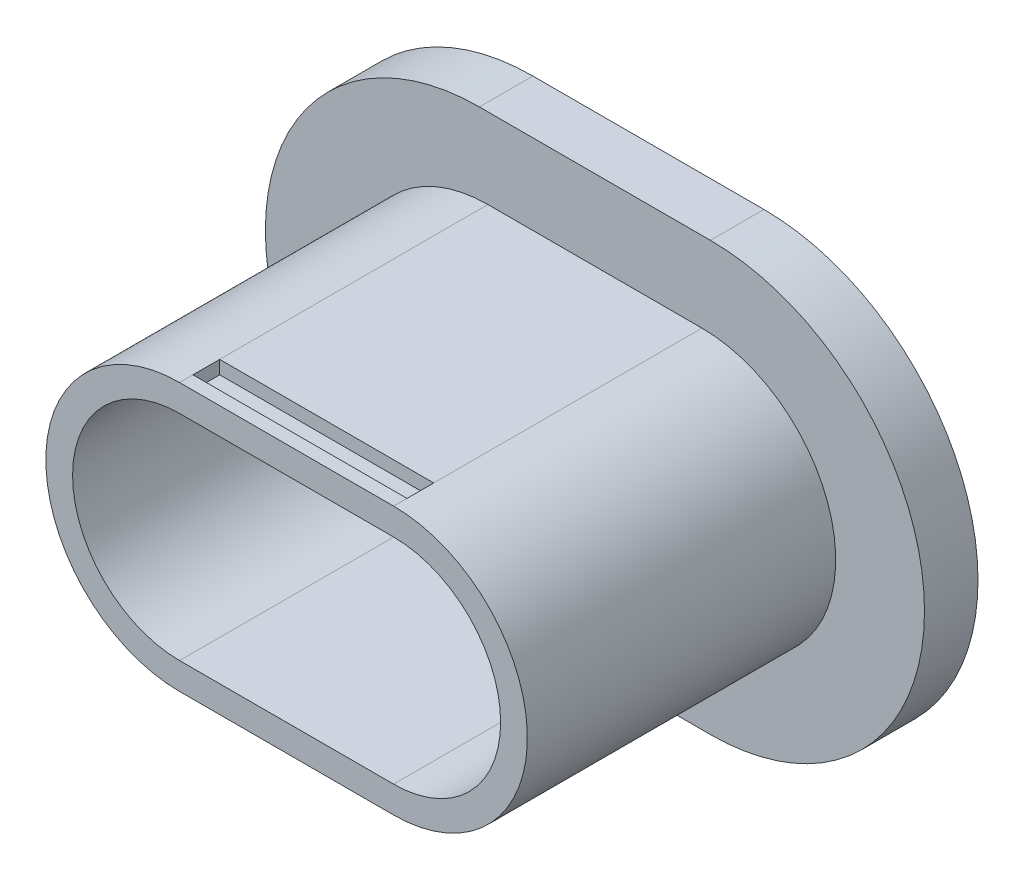
ISO-10303-21;
HEADER;
FILE_DESCRIPTION(('STEP AP214'),'2;1');
FILE_NAME('part.step','',(''),(''),'','','');
FILE_SCHEMA(('AUTOMOTIVE_DESIGN { 1 0 10303 214 1 1 1 1 }'));
ENDSEC;
DATA;
#1=APPLICATION_CONTEXT('core data for automotive mechanical design processes');
#2=APPLICATION_PROTOCOL_DEFINITION('international standard','automotive_design',2000,#1);
#3=PRODUCT_CONTEXT('',#1,'mechanical');
#4=PRODUCT('Part','Part','',(#3));
#5=PRODUCT_RELATED_PRODUCT_CATEGORY('part','',(#4));
#6=PRODUCT_DEFINITION_FORMATION('','',#4);
#7=PRODUCT_DEFINITION_CONTEXT('part definition',#1,'design');
#8=PRODUCT_DEFINITION('design','',#6,#7);
#9=PRODUCT_DEFINITION_SHAPE('','',#8);
#10=(LENGTH_UNIT() NAMED_UNIT(*) SI_UNIT(.MILLI.,.METRE.));
#11=(NAMED_UNIT(*) PLANE_ANGLE_UNIT() SI_UNIT($,.RADIAN.));
#12=(NAMED_UNIT(*) SI_UNIT($,.STERADIAN.) SOLID_ANGLE_UNIT());
#13=UNCERTAINTY_MEASURE_WITH_UNIT(LENGTH_MEASURE(1.E-05),#10,'distance_accuracy_value','');
#14=(GEOMETRIC_REPRESENTATION_CONTEXT(3) GLOBAL_UNCERTAINTY_ASSIGNED_CONTEXT((#13)) GLOBAL_UNIT_ASSIGNED_CONTEXT((#10,
#11,#12)) REPRESENTATION_CONTEXT('',''));
#15=CARTESIAN_POINT('',(0.,0.,0.));
#16=DIRECTION('',(0.,0.,1.));
#17=DIRECTION('',(1.,0.,0.));
#18=AXIS2_PLACEMENT_3D('',#15,#16,#17);
#19=CARTESIAN_POINT('',(20.2441875355783,7.91560724672012,13.525));
#20=DIRECTION('',(0.,-1.,0.));
#21=DIRECTION('',(1.,0.,0.));
#22=AXIS2_PLACEMENT_3D('',#19,#20,#21);
#23=PLANE('',#22);
#24=DIRECTION('',(0.,0.,-1.));
#25=VECTOR('',#24,1.);
#26=CARTESIAN_POINT('',(20.2441875355783,7.91560724672012,13.525));
#27=LINE('',#26,#25);
#28=CARTESIAN_POINT('',(20.2441875355783,7.91560724672012,12.025));
#29=VERTEX_POINT('',#28);
#30=CARTESIAN_POINT('',(20.2441875355783,7.91560724672012,2.));
#31=VERTEX_POINT('',#30);
#32=EDGE_CURVE('E270',#29,#31,#27,.T.);
#33=ORIENTED_EDGE('',*,*,#32,.F.);
#34=DIRECTION('',(-1.,0.,0.));
#35=VECTOR('',#34,1.);
#36=CARTESIAN_POINT('',(20.2441875355783,7.91560724672012,12.025));
#37=LINE('',#36,#35);
#38=CARTESIAN_POINT('',(28.2441875355783,7.91560724672012,12.025));
#39=VERTEX_POINT('',#38);
#40=EDGE_CURVE('E180',#39,#29,#37,.T.);
#41=ORIENTED_EDGE('',*,*,#40,.F.);
#42=DIRECTION('',(0.,0.,-1.));
#43=VECTOR('',#42,1.);
#44=CARTESIAN_POINT('',(28.2441875355783,7.91560724672013,13.525));
#45=LINE('',#44,#43);
#46=CARTESIAN_POINT('',(28.2441875355783,7.91560724672013,2.));
#47=VERTEX_POINT('',#46);
#48=EDGE_CURVE('E284',#39,#47,#45,.T.);
#49=ORIENTED_EDGE('',*,*,#48,.T.);
#50=DIRECTION('',(-1.,0.,0.));
#51=VECTOR('',#50,1.);
#52=CARTESIAN_POINT('',(20.2441875355783,7.91560724672012,2.));
#53=LINE('',#52,#51);
#54=EDGE_CURVE('E264',#47,#31,#53,.T.);
#55=ORIENTED_EDGE('',*,*,#54,.T.);
#56=EDGE_LOOP('',(#33,#41,#49,#55));
#57=FACE_BOUND('',#56,.T.);
#58=ADVANCED_FACE('F47',(#57),#23,.F.);
#59=CARTESIAN_POINT('',(20.2441875355783,-2.08439275327987,13.525));
#60=DIRECTION('',(0.,1.,0.));
#61=DIRECTION('',(-1.,0.,0.));
#62=AXIS2_PLACEMENT_3D('',#59,#60,#61);
#63=PLANE('',#62);
#64=DIRECTION('',(0.,0.,-1.));
#65=VECTOR('',#64,1.);
#66=CARTESIAN_POINT('',(20.2441875355783,-2.08439275327987,13.525));
#67=LINE('',#66,#65);
#68=CARTESIAN_POINT('',(20.2441875355783,-2.08439275327987,13.525));
#69=VERTEX_POINT('',#68);
#70=CARTESIAN_POINT('',(20.2441875355783,-2.08439275327987,13.025));
#71=VERTEX_POINT('',#70);
#72=EDGE_CURVE('E12',#69,#71,#67,.T.);
#73=ORIENTED_EDGE('',*,*,#72,.T.);
#74=DIRECTION('',(-1.,0.,0.));
#75=VECTOR('',#74,1.);
#76=CARTESIAN_POINT('',(20.2441875355783,-2.08439275327987,13.025));
#77=LINE('',#76,#75);
#78=CARTESIAN_POINT('',(28.2441875355783,-2.08439275327987,13.025));
#79=VERTEX_POINT('',#78);
#80=EDGE_CURVE('E203',#79,#71,#77,.T.);
#81=ORIENTED_EDGE('',*,*,#80,.F.);
#82=DIRECTION('',(0.,0.,-1.));
#83=VECTOR('',#82,1.);
#84=CARTESIAN_POINT('',(28.2441875355783,-2.08439275327988,13.525));
#85=LINE('',#84,#83);
#86=CARTESIAN_POINT('',(28.2441875355783,-2.08439275327988,13.525));
#87=VERTEX_POINT('',#86);
#88=EDGE_CURVE('E288',#87,#79,#85,.T.);
#89=ORIENTED_EDGE('',*,*,#88,.F.);
#90=DIRECTION('',(1.,0.,0.));
#91=VECTOR('',#90,1.);
#92=CARTESIAN_POINT('',(20.2441875355783,-2.08439275327987,13.525));
#93=LINE('',#92,#91);
#94=EDGE_CURVE('E263',#69,#87,#93,.T.);
#95=ORIENTED_EDGE('',*,*,#94,.F.);
#96=EDGE_LOOP('',(#73,#81,#89,#95));
#97=FACE_BOUND('',#96,.T.);
#98=ADVANCED_FACE('F324',(#97),#63,.F.);
#99=CARTESIAN_POINT('',(20.2441875355783,2.91560724672013,13.525));
#100=DIRECTION('',(0.,0.,1.));
#101=DIRECTION('',(1.,0.,0.));
#102=AXIS2_PLACEMENT_3D('',#99,#100,#101);
#103=PLANE('',#102);
#104=CARTESIAN_POINT('',(20.2441875355783,2.91560724672013,13.525));
#105=DIRECTION('',(0.,0.,1.));
#106=DIRECTION('',(1.,0.,0.));
#107=AXIS2_PLACEMENT_3D('',#104,#105,#106);
#108=CIRCLE('',#107,5.);
#109=CARTESIAN_POINT('',(20.2441875355783,7.91560724672012,13.525));
#110=VERTEX_POINT('',#109);
#111=EDGE_CURVE('E260',#110,#69,#108,.T.);
#112=ORIENTED_EDGE('',*,*,#111,.T.);
#113=ORIENTED_EDGE('',*,*,#94,.T.);
#114=CARTESIAN_POINT('',(28.2441875355783,2.91560724672013,13.525));
#115=DIRECTION('',(0.,0.,1.));
#116=DIRECTION('',(1.,0.,0.));
#117=AXIS2_PLACEMENT_3D('',#114,#115,#116);
#118=CIRCLE('',#117,5.);
#119=CARTESIAN_POINT('',(28.2441875355783,7.91560724672013,13.525));
#120=VERTEX_POINT('',#119);
#121=EDGE_CURVE('E266',#87,#120,#118,.T.);
#122=ORIENTED_EDGE('',*,*,#121,.T.);
#123=DIRECTION('',(-1.,0.,0.));
#124=VECTOR('',#123,1.);
#125=CARTESIAN_POINT('',(20.2441875355783,7.91560724672012,13.525));
#126=LINE('',#125,#124);
#127=EDGE_CURVE('E268',#120,#110,#126,.T.);
#128=ORIENTED_EDGE('',*,*,#127,.T.);
#129=EDGE_LOOP('',(#112,#113,#122,#128));
#130=FACE_BOUND('',#129,.T.);
#131=DIRECTION('',(1.,0.,0.));
#132=VECTOR('',#131,1.);
#133=CARTESIAN_POINT('',(20.2441875355783,-1.08439275327987,13.525));
#134=LINE('',#133,#132);
#135=CARTESIAN_POINT('',(20.2441875355783,-1.08439275327987,13.525));
#136=VERTEX_POINT('',#135);
#137=CARTESIAN_POINT('',(28.2441875355783,-1.08439275327988,13.525));
#138=VERTEX_POINT('',#137);
#139=EDGE_CURVE('E231',#136,#138,#134,.T.);
#140=ORIENTED_EDGE('',*,*,#139,.F.);
#141=CARTESIAN_POINT('',(20.2441875355783,2.91560724672013,13.525));
#142=DIRECTION('',(0.,0.,1.));
#143=DIRECTION('',(1.,0.,0.));
#144=AXIS2_PLACEMENT_3D('',#141,#142,#143);
#145=CIRCLE('',#144,4.);
#146=CARTESIAN_POINT('',(20.2441875355783,6.91560724672012,13.525));
#147=VERTEX_POINT('',#146);
#148=EDGE_CURVE('E229',#147,#136,#145,.T.);
#149=ORIENTED_EDGE('',*,*,#148,.F.);
#150=DIRECTION('',(-1.,0.,0.));
#151=VECTOR('',#150,1.);
#152=CARTESIAN_POINT('',(20.2441875355783,6.91560724672012,13.525));
#153=LINE('',#152,#151);
#154=CARTESIAN_POINT('',(28.2441875355783,6.91560724672013,13.525));
#155=VERTEX_POINT('',#154);
#156=EDGE_CURVE('E237',#155,#147,#153,.T.);
#157=ORIENTED_EDGE('',*,*,#156,.F.);
#158=CARTESIAN_POINT('',(28.2441875355783,2.91560724672013,13.525));
#159=DIRECTION('',(0.,0.,1.));
#160=DIRECTION('',(1.,0.,0.));
#161=AXIS2_PLACEMENT_3D('',#158,#159,#160);
#162=CIRCLE('',#161,4.);
#163=EDGE_CURVE('E234',#138,#155,#162,.T.);
#164=ORIENTED_EDGE('',*,*,#163,.F.);
#165=EDGE_LOOP('',(#140,#149,#157,#164));
#166=FACE_BOUND('',#165,.T.);
#167=ADVANCED_FACE('F319',(#130,#166),#103,.T.);
#168=CARTESIAN_POINT('',(20.2441875355783,2.91560724672013,2.));
#169=DIRECTION('',(0.,0.,1.));
#170=DIRECTION('',(1.,0.,0.));
#171=AXIS2_PLACEMENT_3D('',#168,#169,#170);
#172=PLANE('',#171);
#173=CARTESIAN_POINT('',(20.2441875355783,2.91560724672013,2.));
#174=DIRECTION('',(0.,0.,1.));
#175=DIRECTION('',(1.,0.,0.));
#176=AXIS2_PLACEMENT_3D('',#173,#174,#175);
#177=CIRCLE('',#176,5.);
#178=CARTESIAN_POINT('',(20.2441875355783,-2.08439275327987,2.));
#179=VERTEX_POINT('',#178);
#180=EDGE_CURVE('E259',#31,#179,#177,.T.);
#181=ORIENTED_EDGE('',*,*,#180,.F.);
#182=ORIENTED_EDGE('',*,*,#54,.F.);
#183=CARTESIAN_POINT('',(28.2441875355783,2.91560724672013,2.));
#184=DIRECTION('',(0.,0.,1.));
#185=DIRECTION('',(1.,0.,0.));
#186=AXIS2_PLACEMENT_3D('',#183,#184,#185);
#187=CIRCLE('',#186,5.);
#188=CARTESIAN_POINT('',(28.2441875355783,-2.08439275327988,2.));
#189=VERTEX_POINT('',#188);
#190=EDGE_CURVE('E276',#189,#47,#187,.T.);
#191=ORIENTED_EDGE('',*,*,#190,.F.);
#192=DIRECTION('',(1.,0.,0.));
#193=VECTOR('',#192,1.);
#194=CARTESIAN_POINT('',(20.2441875355783,-2.08439275327987,2.));
#195=LINE('',#194,#193);
#196=EDGE_CURVE('E273',#179,#189,#195,.T.);
#197=ORIENTED_EDGE('',*,*,#196,.F.);
#198=EDGE_LOOP('',(#181,#182,#191,#197));
#199=FACE_BOUND('',#198,.T.);
#200=CARTESIAN_POINT('',(20.2441875355783,2.91560724672013,2.));
#201=DIRECTION('',(0.,0.,1.));
#202=DIRECTION('',(1.,0.,0.));
#203=AXIS2_PLACEMENT_3D('',#200,#201,#202);
#204=CIRCLE('',#203,4.);
#205=CARTESIAN_POINT('',(20.2441875355783,6.91560724672012,2.));
#206=VERTEX_POINT('',#205);
#207=CARTESIAN_POINT('',(20.2441875355783,-1.08439275327987,2.));
#208=VERTEX_POINT('',#207);
#209=EDGE_CURVE('E223',#206,#208,#204,.T.);
#210=ORIENTED_EDGE('',*,*,#209,.T.);
#211=DIRECTION('',(1.,0.,0.));
#212=VECTOR('',#211,1.);
#213=CARTESIAN_POINT('',(20.2441875355783,-1.08439275327987,2.));
#214=LINE('',#213,#212);
#215=CARTESIAN_POINT('',(28.2441875355783,-1.08439275327988,2.));
#216=VERTEX_POINT('',#215);
#217=EDGE_CURVE('E242',#208,#216,#214,.T.);
#218=ORIENTED_EDGE('',*,*,#217,.T.);
#219=CARTESIAN_POINT('',(28.2441875355783,2.91560724672013,2.));
#220=DIRECTION('',(0.,0.,1.));
#221=DIRECTION('',(1.,0.,0.));
#222=AXIS2_PLACEMENT_3D('',#219,#220,#221);
#223=CIRCLE('',#222,4.);
#224=CARTESIAN_POINT('',(28.2441875355783,6.91560724672013,2.));
#225=VERTEX_POINT('',#224);
#226=EDGE_CURVE('E245',#216,#225,#223,.T.);
#227=ORIENTED_EDGE('',*,*,#226,.T.);
#228=DIRECTION('',(-1.,0.,0.));
#229=VECTOR('',#228,1.);
#230=CARTESIAN_POINT('',(20.2441875355783,6.91560724672012,2.));
#231=LINE('',#230,#229);
#232=EDGE_CURVE('E232',#225,#206,#231,.T.);
#233=ORIENTED_EDGE('',*,*,#232,.T.);
#234=EDGE_LOOP('',(#210,#218,#227,#233));
#235=FACE_BOUND('',#234,.T.);
#236=ADVANCED_FACE('F305',(#199,#235),#172,.F.);
#237=CARTESIAN_POINT('',(20.2441875355783,2.91560724672013,13.525));
#238=DIRECTION('',(0.,0.,-1.));
#239=DIRECTION('',(-1.,0.,0.));
#240=AXIS2_PLACEMENT_3D('',#237,#238,#239);
#241=CYLINDRICAL_SURFACE('',#240,5.);
#242=ORIENTED_EDGE('',*,*,#180,.T.);
#243=CARTESIAN_POINT('',(20.2441875355783,-2.08439275327987,12.025));
#244=VERTEX_POINT('',#243);
#245=EDGE_CURVE('E55',#244,#179,#67,.T.);
#246=ORIENTED_EDGE('',*,*,#245,.F.);
#247=DIRECTION('',(0.,0.,-1.));
#248=VECTOR('',#247,1.);
#249=CARTESIAN_POINT('',(20.2441875355783,-2.08439275327987,13.025));
#250=LINE('',#249,#248);
#251=EDGE_CURVE('E195',#71,#244,#250,.T.);
#252=ORIENTED_EDGE('',*,*,#251,.F.);
#253=ORIENTED_EDGE('',*,*,#72,.F.);
#254=ORIENTED_EDGE('',*,*,#111,.F.);
#255=CARTESIAN_POINT('',(20.2441875355783,7.91560724672012,13.025));
#256=VERTEX_POINT('',#255);
#257=EDGE_CURVE('E281',#110,#256,#27,.T.);
#258=ORIENTED_EDGE('',*,*,#257,.T.);
#259=DIRECTION('',(0.,0.,1.));
#260=VECTOR('',#259,1.);
#261=CARTESIAN_POINT('',(20.2441875355783,7.91560724672012,12.025));
#262=LINE('',#261,#260);
#263=EDGE_CURVE('E62',#29,#256,#262,.T.);
#264=ORIENTED_EDGE('',*,*,#263,.F.);
#265=ORIENTED_EDGE('',*,*,#32,.T.);
#266=EDGE_LOOP('',(#242,#246,#252,#253,#254,#258,#264,#265));
#267=FACE_BOUND('',#266,.T.);
#268=ADVANCED_FACE('F49',(#267),#241,.T.);
#269=CARTESIAN_POINT('',(28.2441875355783,-2.08439275327988,12.025));
#270=VERTEX_POINT('',#269);
#271=EDGE_CURVE('E287',#270,#189,#85,.T.);
#272=ORIENTED_EDGE('',*,*,#271,.F.);
#273=DIRECTION('',(1.,0.,0.));
#274=VECTOR('',#273,1.);
#275=CARTESIAN_POINT('',(20.2441875355783,-2.08439275327987,12.025));
#276=LINE('',#275,#274);
#277=EDGE_CURVE('E70',#244,#270,#276,.T.);
#278=ORIENTED_EDGE('',*,*,#277,.F.);
#279=ORIENTED_EDGE('',*,*,#245,.T.);
#280=ORIENTED_EDGE('',*,*,#196,.T.);
#281=EDGE_LOOP('',(#272,#278,#279,#280));
#282=FACE_BOUND('',#281,.T.);
#283=ADVANCED_FACE('F301',(#282),#63,.F.);
#284=CARTESIAN_POINT('',(28.2441875355783,2.91560724672013,13.525));
#285=DIRECTION('',(0.,0.,-1.));
#286=DIRECTION('',(-1.,0.,0.));
#287=AXIS2_PLACEMENT_3D('',#284,#285,#286);
#288=CYLINDRICAL_SURFACE('',#287,5.);
#289=ORIENTED_EDGE('',*,*,#190,.T.);
#290=ORIENTED_EDGE('',*,*,#48,.F.);
#291=DIRECTION('',(0.,0.,-1.));
#292=VECTOR('',#291,1.);
#293=CARTESIAN_POINT('',(28.2441875355783,7.91560724672012,12.025));
#294=LINE('',#293,#292);
#295=CARTESIAN_POINT('',(28.2441875355783,7.91560724672012,13.025));
#296=VERTEX_POINT('',#295);
#297=EDGE_CURVE('E183',#296,#39,#294,.T.);
#298=ORIENTED_EDGE('',*,*,#297,.F.);
#299=EDGE_CURVE('E285',#120,#296,#45,.T.);
#300=ORIENTED_EDGE('',*,*,#299,.F.);
#301=ORIENTED_EDGE('',*,*,#121,.F.);
#302=ORIENTED_EDGE('',*,*,#88,.T.);
#303=DIRECTION('',(0.,0.,1.));
#304=VECTOR('',#303,1.);
#305=CARTESIAN_POINT('',(28.2441875355783,-2.08439275327987,13.025));
#306=LINE('',#305,#304);
#307=EDGE_CURVE('E216',#270,#79,#306,.T.);
#308=ORIENTED_EDGE('',*,*,#307,.F.);
#309=ORIENTED_EDGE('',*,*,#271,.T.);
#310=EDGE_LOOP('',(#289,#290,#298,#300,#301,#302,#308,#309));
#311=FACE_BOUND('',#310,.T.);
#312=ADVANCED_FACE('F295',(#311),#288,.T.);
#313=ORIENTED_EDGE('',*,*,#299,.T.);
#314=DIRECTION('',(1.,0.,0.));
#315=VECTOR('',#314,1.);
#316=CARTESIAN_POINT('',(20.2441875355783,7.91560724672012,13.025));
#317=LINE('',#316,#315);
#318=EDGE_CURVE('E189',#256,#296,#317,.T.);
#319=ORIENTED_EDGE('',*,*,#318,.F.);
#320=ORIENTED_EDGE('',*,*,#257,.F.);
#321=ORIENTED_EDGE('',*,*,#127,.F.);
#322=EDGE_LOOP('',(#313,#319,#320,#321));
#323=FACE_BOUND('',#322,.T.);
#324=ADVANCED_FACE('F315',(#323),#23,.F.);
#325=CARTESIAN_POINT('',(20.2441875355783,2.91560724672013,13.525));
#326=DIRECTION('',(0.,0.,-1.));
#327=DIRECTION('',(-1.,0.,0.));
#328=AXIS2_PLACEMENT_3D('',#325,#326,#327);
#329=CYLINDRICAL_SURFACE('',#328,4.);
#330=ORIENTED_EDGE('',*,*,#209,.F.);
#331=DIRECTION('',(0.,0.,-1.));
#332=VECTOR('',#331,1.);
#333=CARTESIAN_POINT('',(20.2441875355783,6.91560724672012,13.525));
#334=LINE('',#333,#332);
#335=EDGE_CURVE('E239',#147,#206,#334,.T.);
#336=ORIENTED_EDGE('',*,*,#335,.F.);
#337=ORIENTED_EDGE('',*,*,#148,.T.);
#338=DIRECTION('',(0.,0.,-1.));
#339=VECTOR('',#338,1.);
#340=CARTESIAN_POINT('',(20.2441875355783,-1.08439275327987,13.525));
#341=LINE('',#340,#339);
#342=EDGE_CURVE('E256',#136,#208,#341,.T.);
#343=ORIENTED_EDGE('',*,*,#342,.T.);
#344=EDGE_LOOP('',(#330,#336,#337,#343));
#345=FACE_BOUND('',#344,.T.);
#346=ADVANCED_FACE('F357',(#345),#329,.F.);
#347=CARTESIAN_POINT('',(20.2441875355783,-1.08439275327987,13.525));
#348=DIRECTION('',(0.,1.,0.));
#349=DIRECTION('',(-1.,0.,0.));
#350=AXIS2_PLACEMENT_3D('',#347,#348,#349);
#351=PLANE('',#350);
#352=ORIENTED_EDGE('',*,*,#217,.F.);
#353=ORIENTED_EDGE('',*,*,#342,.F.);
#354=ORIENTED_EDGE('',*,*,#139,.T.);
#355=DIRECTION('',(0.,0.,-1.));
#356=VECTOR('',#355,1.);
#357=CARTESIAN_POINT('',(28.2441875355783,-1.08439275327988,13.525));
#358=LINE('',#357,#356);
#359=EDGE_CURVE('E254',#138,#216,#358,.T.);
#360=ORIENTED_EDGE('',*,*,#359,.T.);
#361=EDGE_LOOP('',(#352,#353,#354,#360));
#362=FACE_BOUND('',#361,.T.);
#363=ADVANCED_FACE('F362',(#362),#351,.T.);
#364=CARTESIAN_POINT('',(28.2441875355783,2.91560724672013,13.525));
#365=DIRECTION('',(0.,0.,-1.));
#366=DIRECTION('',(-1.,0.,0.));
#367=AXIS2_PLACEMENT_3D('',#364,#365,#366);
#368=CYLINDRICAL_SURFACE('',#367,4.);
#369=ORIENTED_EDGE('',*,*,#226,.F.);
#370=ORIENTED_EDGE('',*,*,#359,.F.);
#371=ORIENTED_EDGE('',*,*,#163,.T.);
#372=DIRECTION('',(0.,0.,-1.));
#373=VECTOR('',#372,1.);
#374=CARTESIAN_POINT('',(28.2441875355783,6.91560724672013,13.525));
#375=LINE('',#374,#373);
#376=EDGE_CURVE('E252',#155,#225,#375,.T.);
#377=ORIENTED_EDGE('',*,*,#376,.T.);
#378=EDGE_LOOP('',(#369,#370,#371,#377));
#379=FACE_BOUND('',#378,.T.);
#380=ADVANCED_FACE('F381',(#379),#368,.F.);
#381=CARTESIAN_POINT('',(20.2441875355783,6.91560724672012,13.525));
#382=DIRECTION('',(0.,-1.,0.));
#383=DIRECTION('',(1.,0.,0.));
#384=AXIS2_PLACEMENT_3D('',#381,#382,#383);
#385=PLANE('',#384);
#386=ORIENTED_EDGE('',*,*,#232,.F.);
#387=ORIENTED_EDGE('',*,*,#376,.F.);
#388=ORIENTED_EDGE('',*,*,#156,.T.);
#389=ORIENTED_EDGE('',*,*,#335,.T.);
#390=EDGE_LOOP('',(#386,#387,#388,#389));
#391=FACE_BOUND('',#390,.T.);
#392=ADVANCED_FACE('F385',(#391),#385,.T.);
#393=CARTESIAN_POINT('',(20.2441875355783,-1.58439275327987,13.025));
#394=DIRECTION('',(-1.,0.,0.));
#395=DIRECTION('',(0.,-1.,0.));
#396=AXIS2_PLACEMENT_3D('',#393,#394,#395);
#397=PLANE('',#396);
#398=ORIENTED_EDGE('',*,*,#251,.T.);
#399=DIRECTION('',(0.,-1.,0.));
#400=VECTOR('',#399,1.);
#401=CARTESIAN_POINT('',(20.2441875355783,-1.58439275327987,12.025));
#402=LINE('',#401,#400);
#403=CARTESIAN_POINT('',(20.2441875355783,-1.58439275327987,12.025));
#404=VERTEX_POINT('',#403);
#405=EDGE_CURVE('E212',#404,#244,#402,.T.);
#406=ORIENTED_EDGE('',*,*,#405,.F.);
#407=DIRECTION('',(0.,0.,-1.));
#408=VECTOR('',#407,1.);
#409=CARTESIAN_POINT('',(20.2441875355783,-1.58439275327987,13.025));
#410=LINE('',#409,#408);
#411=CARTESIAN_POINT('',(20.2441875355783,-1.58439275327987,13.025));
#412=VERTEX_POINT('',#411);
#413=EDGE_CURVE('E199',#412,#404,#410,.T.);
#414=ORIENTED_EDGE('',*,*,#413,.F.);
#415=DIRECTION('',(0.,-1.,0.));
#416=VECTOR('',#415,1.);
#417=CARTESIAN_POINT('',(20.2441875355783,-1.58439275327987,13.025));
#418=LINE('',#417,#416);
#419=EDGE_CURVE('E221',#412,#71,#418,.T.);
#420=ORIENTED_EDGE('',*,*,#419,.T.);
#421=EDGE_LOOP('',(#398,#406,#414,#420));
#422=FACE_BOUND('',#421,.T.);
#423=ADVANCED_FACE('F332',(#422),#397,.F.);
#424=CARTESIAN_POINT('',(20.2441875355783,-1.58439275327987,13.025));
#425=DIRECTION('',(0.,0.,1.));
#426=DIRECTION('',(1.,0.,0.));
#427=AXIS2_PLACEMENT_3D('',#424,#425,#426);
#428=PLANE('',#427);
#429=ORIENTED_EDGE('',*,*,#80,.T.);
#430=ORIENTED_EDGE('',*,*,#419,.F.);
#431=DIRECTION('',(-1.,0.,0.));
#432=VECTOR('',#431,1.);
#433=CARTESIAN_POINT('',(20.2441875355783,-1.58439275327987,13.025));
#434=LINE('',#433,#432);
#435=CARTESIAN_POINT('',(28.2441875355783,-1.58439275327987,13.025));
#436=VERTEX_POINT('',#435);
#437=EDGE_CURVE('E209',#436,#412,#434,.T.);
#438=ORIENTED_EDGE('',*,*,#437,.F.);
#439=DIRECTION('',(0.,-1.,0.));
#440=VECTOR('',#439,1.);
#441=CARTESIAN_POINT('',(28.2441875355783,-1.58439275327987,13.025));
#442=LINE('',#441,#440);
#443=EDGE_CURVE('E224',#436,#79,#442,.T.);
#444=ORIENTED_EDGE('',*,*,#443,.T.);
#445=EDGE_LOOP('',(#429,#430,#438,#444));
#446=FACE_BOUND('',#445,.T.);
#447=ADVANCED_FACE('F327',(#446),#428,.F.);
#448=CARTESIAN_POINT('',(28.2441875355783,-1.58439275327987,13.025));
#449=DIRECTION('',(1.,0.,0.));
#450=DIRECTION('',(0.,1.,0.));
#451=AXIS2_PLACEMENT_3D('',#448,#449,#450);
#452=PLANE('',#451);
#453=ORIENTED_EDGE('',*,*,#307,.T.);
#454=ORIENTED_EDGE('',*,*,#443,.F.);
#455=DIRECTION('',(0.,0.,1.));
#456=VECTOR('',#455,1.);
#457=CARTESIAN_POINT('',(28.2441875355783,-1.58439275327987,13.025));
#458=LINE('',#457,#456);
#459=CARTESIAN_POINT('',(28.2441875355783,-1.58439275327987,12.025));
#460=VERTEX_POINT('',#459);
#461=EDGE_CURVE('E206',#460,#436,#458,.T.);
#462=ORIENTED_EDGE('',*,*,#461,.F.);
#463=DIRECTION('',(0.,-1.,0.));
#464=VECTOR('',#463,1.);
#465=CARTESIAN_POINT('',(28.2441875355783,-1.58439275327987,12.025));
#466=LINE('',#465,#464);
#467=EDGE_CURVE('E226',#460,#270,#466,.T.);
#468=ORIENTED_EDGE('',*,*,#467,.T.);
#469=EDGE_LOOP('',(#453,#454,#462,#468));
#470=FACE_BOUND('',#469,.T.);
#471=ADVANCED_FACE('F338',(#470),#452,.F.);
#472=CARTESIAN_POINT('',(20.2441875355783,-1.58439275327987,12.025));
#473=DIRECTION('',(0.,0.,-1.));
#474=DIRECTION('',(-1.,0.,0.));
#475=AXIS2_PLACEMENT_3D('',#472,#473,#474);
#476=PLANE('',#475);
#477=ORIENTED_EDGE('',*,*,#277,.T.);
#478=ORIENTED_EDGE('',*,*,#467,.F.);
#479=DIRECTION('',(1.,0.,0.));
#480=VECTOR('',#479,1.);
#481=CARTESIAN_POINT('',(20.2441875355783,-1.58439275327987,12.025));
#482=LINE('',#481,#480);
#483=EDGE_CURVE('E202',#404,#460,#482,.T.);
#484=ORIENTED_EDGE('',*,*,#483,.F.);
#485=ORIENTED_EDGE('',*,*,#405,.T.);
#486=EDGE_LOOP('',(#477,#478,#484,#485));
#487=FACE_BOUND('',#486,.T.);
#488=ADVANCED_FACE('F339',(#487),#476,.F.);
#489=CARTESIAN_POINT('',(0.,-1.58439275327987,0.));
#490=DIRECTION('',(0.,-1.,0.));
#491=DIRECTION('',(1.,0.,0.));
#492=AXIS2_PLACEMENT_3D('',#489,#490,#491);
#493=PLANE('',#492);
#494=ORIENTED_EDGE('',*,*,#413,.T.);
#495=ORIENTED_EDGE('',*,*,#483,.T.);
#496=ORIENTED_EDGE('',*,*,#461,.T.);
#497=ORIENTED_EDGE('',*,*,#437,.T.);
#498=EDGE_LOOP('',(#494,#495,#496,#497));
#499=FACE_BOUND('',#498,.T.);
#500=ADVANCED_FACE('F335',(#499),#493,.T.);
#501=CARTESIAN_POINT('',(20.2441875355783,7.41560724672012,12.025));
#502=DIRECTION('',(-1.,0.,0.));
#503=DIRECTION('',(0.,0.,1.));
#504=AXIS2_PLACEMENT_3D('',#501,#502,#503);
#505=PLANE('',#504);
#506=ORIENTED_EDGE('',*,*,#263,.T.);
#507=DIRECTION('',(0.,1.,0.));
#508=VECTOR('',#507,1.);
#509=CARTESIAN_POINT('',(20.2441875355783,7.41560724672012,13.025));
#510=LINE('',#509,#508);
#511=CARTESIAN_POINT('',(20.2441875355783,7.41560724672012,13.025));
#512=VERTEX_POINT('',#511);
#513=EDGE_CURVE('E158',#512,#256,#510,.T.);
#514=ORIENTED_EDGE('',*,*,#513,.F.);
#515=DIRECTION('',(0.,0.,1.));
#516=VECTOR('',#515,1.);
#517=CARTESIAN_POINT('',(20.2441875355783,7.41560724672012,12.025));
#518=LINE('',#517,#516);
#519=CARTESIAN_POINT('',(20.2441875355783,7.41560724672012,12.025));
#520=VERTEX_POINT('',#519);
#521=EDGE_CURVE('E162',#520,#512,#518,.T.);
#522=ORIENTED_EDGE('',*,*,#521,.F.);
#523=DIRECTION('',(0.,1.,0.));
#524=VECTOR('',#523,1.);
#525=CARTESIAN_POINT('',(20.2441875355783,7.41560724672012,12.025));
#526=LINE('',#525,#524);
#527=EDGE_CURVE('E193',#520,#29,#526,.T.);
#528=ORIENTED_EDGE('',*,*,#527,.T.);
#529=EDGE_LOOP('',(#506,#514,#522,#528));
#530=FACE_BOUND('',#529,.T.);
#531=ADVANCED_FACE('F160',(#530),#505,.F.);
#532=CARTESIAN_POINT('',(20.2441875355783,7.41560724672012,12.025));
#533=DIRECTION('',(0.,0.,-1.));
#534=DIRECTION('',(-1.,0.,0.));
#535=AXIS2_PLACEMENT_3D('',#532,#533,#534);
#536=PLANE('',#535);
#537=ORIENTED_EDGE('',*,*,#40,.T.);
#538=ORIENTED_EDGE('',*,*,#527,.F.);
#539=DIRECTION('',(-1.,0.,0.));
#540=VECTOR('',#539,1.);
#541=CARTESIAN_POINT('',(20.2441875355783,7.41560724672012,12.025));
#542=LINE('',#541,#540);
#543=CARTESIAN_POINT('',(28.2441875355783,7.41560724672012,12.025));
#544=VERTEX_POINT('',#543);
#545=EDGE_CURVE('E168',#544,#520,#542,.T.);
#546=ORIENTED_EDGE('',*,*,#545,.F.);
#547=DIRECTION('',(0.,1.,0.));
#548=VECTOR('',#547,1.);
#549=CARTESIAN_POINT('',(28.2441875355783,7.41560724672012,12.025));
#550=LINE('',#549,#548);
#551=EDGE_CURVE('E196',#544,#39,#550,.T.);
#552=ORIENTED_EDGE('',*,*,#551,.T.);
#553=EDGE_LOOP('',(#537,#538,#546,#552));
#554=FACE_BOUND('',#553,.T.);
#555=ADVANCED_FACE('F399',(#554),#536,.F.);
#556=CARTESIAN_POINT('',(28.2441875355783,7.41560724672012,12.025));
#557=DIRECTION('',(1.,0.,0.));
#558=DIRECTION('',(0.,0.,-1.));
#559=AXIS2_PLACEMENT_3D('',#556,#557,#558);
#560=PLANE('',#559);
#561=ORIENTED_EDGE('',*,*,#297,.T.);
#562=ORIENTED_EDGE('',*,*,#551,.F.);
#563=DIRECTION('',(0.,0.,-1.));
#564=VECTOR('',#563,1.);
#565=CARTESIAN_POINT('',(28.2441875355783,7.41560724672012,12.025));
#566=LINE('',#565,#564);
#567=CARTESIAN_POINT('',(28.2441875355783,7.41560724672012,13.025));
#568=VERTEX_POINT('',#567);
#569=EDGE_CURVE('E176',#568,#544,#566,.T.);
#570=ORIENTED_EDGE('',*,*,#569,.F.);
#571=DIRECTION('',(0.,1.,0.));
#572=VECTOR('',#571,1.);
#573=CARTESIAN_POINT('',(28.2441875355783,7.41560724672012,13.025));
#574=LINE('',#573,#572);
#575=EDGE_CURVE('E167',#568,#296,#574,.T.);
#576=ORIENTED_EDGE('',*,*,#575,.T.);
#577=EDGE_LOOP('',(#561,#562,#570,#576));
#578=FACE_BOUND('',#577,.T.);
#579=ADVANCED_FACE('F402',(#578),#560,.F.);
#580=CARTESIAN_POINT('',(20.2441875355783,7.41560724672012,13.025));
#581=DIRECTION('',(0.,0.,1.));
#582=DIRECTION('',(1.,0.,0.));
#583=AXIS2_PLACEMENT_3D('',#580,#581,#582);
#584=PLANE('',#583);
#585=ORIENTED_EDGE('',*,*,#318,.T.);
#586=ORIENTED_EDGE('',*,*,#575,.F.);
#587=DIRECTION('',(1.,0.,0.));
#588=VECTOR('',#587,1.);
#589=CARTESIAN_POINT('',(20.2441875355783,7.41560724672012,13.025));
#590=LINE('',#589,#588);
#591=EDGE_CURVE('E171',#512,#568,#590,.T.);
#592=ORIENTED_EDGE('',*,*,#591,.F.);
#593=ORIENTED_EDGE('',*,*,#513,.T.);
#594=EDGE_LOOP('',(#585,#586,#592,#593));
#595=FACE_BOUND('',#594,.T.);
#596=ADVANCED_FACE('F172',(#595),#584,.F.);
#597=CARTESIAN_POINT('',(0.,7.41560724672012,0.));
#598=DIRECTION('',(0.,1.,0.));
#599=DIRECTION('',(0.,0.,1.));
#600=AXIS2_PLACEMENT_3D('',#597,#598,#599);
#601=PLANE('',#600);
#602=ORIENTED_EDGE('',*,*,#521,.T.);
#603=ORIENTED_EDGE('',*,*,#591,.T.);
#604=ORIENTED_EDGE('',*,*,#569,.T.);
#605=ORIENTED_EDGE('',*,*,#545,.T.);
#606=EDGE_LOOP('',(#602,#603,#604,#605));
#607=FACE_BOUND('',#606,.T.);
#608=ADVANCED_FACE('F178',(#607),#601,.T.);
#609=CLOSED_SHELL('',(#58,#98,#167,#236,#268,#283,#312,#324,#346,#363,#380,#392,#423,#447,#471,
#488,#500,#531,#555,#579,#596,#608));
#610=MANIFOLD_SOLID_BREP('B2',#609);
#611=CARTESIAN_POINT('',(19.9257161979987,2.91560724672013,2.));
#612=DIRECTION('',(0.,0.,1.));
#613=DIRECTION('',(1.,0.,0.));
#614=AXIS2_PLACEMENT_3D('',#611,#612,#613);
#615=PLANE('',#614);
#616=CARTESIAN_POINT('',(19.9257161979987,2.91560724672013,2.));
#617=DIRECTION('',(0.,0.,1.));
#618=DIRECTION('',(1.,0.,0.));
#619=AXIS2_PLACEMENT_3D('',#616,#617,#618);
#620=CIRCLE('',#619,8.);
#621=CARTESIAN_POINT('',(19.9257161979987,10.9156072467201,2.));
#622=VERTEX_POINT('',#621);
#623=CARTESIAN_POINT('',(19.9257161979987,-5.08439275327987,2.));
#624=VERTEX_POINT('',#623);
#625=EDGE_CURVE('E680',#622,#624,#620,.T.);
#626=ORIENTED_EDGE('',*,*,#625,.T.);
#627=DIRECTION('',(1.,0.,0.));
#628=VECTOR('',#627,1.);
#629=CARTESIAN_POINT('',(19.9257161979987,-5.08439275327987,2.));
#630=LINE('',#629,#628);
#631=CARTESIAN_POINT('',(28.5626588731579,-5.08439275327988,2.));
#632=VERTEX_POINT('',#631);
#633=EDGE_CURVE('E683',#624,#632,#630,.T.);
#634=ORIENTED_EDGE('',*,*,#633,.T.);
#635=CARTESIAN_POINT('',(28.5626588731579,2.91560724672013,2.));
#636=DIRECTION('',(0.,0.,1.));
#637=DIRECTION('',(1.,0.,0.));
#638=AXIS2_PLACEMENT_3D('',#635,#636,#637);
#639=CIRCLE('',#638,8.);
#640=CARTESIAN_POINT('',(28.5626588731579,10.9156072467201,2.));
#641=VERTEX_POINT('',#640);
#642=EDGE_CURVE('E686',#632,#641,#639,.T.);
#643=ORIENTED_EDGE('',*,*,#642,.T.);
#644=DIRECTION('',(-1.,0.,0.));
#645=VECTOR('',#644,1.);
#646=CARTESIAN_POINT('',(19.9257161979987,10.9156072467201,2.));
#647=LINE('',#646,#645);
#648=EDGE_CURVE('E688',#641,#622,#647,.T.);
#649=ORIENTED_EDGE('',*,*,#648,.T.);
#650=EDGE_LOOP('',(#626,#634,#643,#649));
#651=FACE_BOUND('',#650,.T.);
#652=DIRECTION('',(1.,0.,0.));
#653=VECTOR('',#652,1.);
#654=CARTESIAN_POINT('',(20.2441875355783,-1.08439275327987,2.));
#655=LINE('',#654,#653);
#656=CARTESIAN_POINT('',(20.2441875355783,-1.08439275327987,2.));
#657=VERTEX_POINT('',#656);
#658=CARTESIAN_POINT('',(28.2441875355783,-1.08439275327988,2.));
#659=VERTEX_POINT('',#658);
#660=EDGE_CURVE('E652',#657,#659,#655,.T.);
#661=ORIENTED_EDGE('',*,*,#660,.F.);
#662=CARTESIAN_POINT('',(20.2441875355783,2.91560724672013,2.));
#663=DIRECTION('',(0.,0.,1.));
#664=DIRECTION('',(1.,0.,0.));
#665=AXIS2_PLACEMENT_3D('',#662,#663,#664);
#666=CIRCLE('',#665,4.);
#667=CARTESIAN_POINT('',(20.2441875355783,6.91560724672012,2.));
#668=VERTEX_POINT('',#667);
#669=EDGE_CURVE('E644',#668,#657,#666,.T.);
#670=ORIENTED_EDGE('',*,*,#669,.F.);
#671=DIRECTION('',(-1.,0.,0.));
#672=VECTOR('',#671,1.);
#673=CARTESIAN_POINT('',(20.2441875355783,6.91560724672012,2.));
#674=LINE('',#673,#672);
#675=CARTESIAN_POINT('',(28.2441875355783,6.91560724672013,2.));
#676=VERTEX_POINT('',#675);
#677=EDGE_CURVE('E666',#676,#668,#674,.T.);
#678=ORIENTED_EDGE('',*,*,#677,.F.);
#679=CARTESIAN_POINT('',(28.2441875355783,2.91560724672013,2.));
#680=DIRECTION('',(0.,0.,1.));
#681=DIRECTION('',(1.,0.,0.));
#682=AXIS2_PLACEMENT_3D('',#679,#680,#681);
#683=CIRCLE('',#682,4.);
#684=EDGE_CURVE('E664',#659,#676,#683,.T.);
#685=ORIENTED_EDGE('',*,*,#684,.F.);
#686=EDGE_LOOP('',(#661,#670,#678,#685));
#687=FACE_BOUND('',#686,.T.);
#688=ADVANCED_FACE('F579',(#651,#687),#615,.T.);
#689=CARTESIAN_POINT('',(19.9257161979987,2.91560724672013,0.));
#690=DIRECTION('',(0.,0.,1.));
#691=DIRECTION('',(1.,0.,0.));
#692=AXIS2_PLACEMENT_3D('',#689,#690,#691);
#693=PLANE('',#692);
#694=CARTESIAN_POINT('',(19.9257161979987,2.91560724672013,0.));
#695=DIRECTION('',(0.,0.,1.));
#696=DIRECTION('',(1.,0.,0.));
#697=AXIS2_PLACEMENT_3D('',#694,#695,#696);
#698=CIRCLE('',#697,8.);
#699=CARTESIAN_POINT('',(19.9257161979987,10.9156072467201,0.));
#700=VERTEX_POINT('',#699);
#701=CARTESIAN_POINT('',(19.9257161979987,-5.08439275327987,0.));
#702=VERTEX_POINT('',#701);
#703=EDGE_CURVE('E660',#700,#702,#698,.T.);
#704=ORIENTED_EDGE('',*,*,#703,.F.);
#705=DIRECTION('',(-1.,0.,0.));
#706=VECTOR('',#705,1.);
#707=CARTESIAN_POINT('',(19.9257161979987,10.9156072467201,0.));
#708=LINE('',#707,#706);
#709=CARTESIAN_POINT('',(28.5626588731579,10.9156072467201,0.));
#710=VERTEX_POINT('',#709);
#711=EDGE_CURVE('E684',#710,#700,#708,.T.);
#712=ORIENTED_EDGE('',*,*,#711,.F.);
#713=CARTESIAN_POINT('',(28.5626588731579,2.91560724672013,0.));
#714=DIRECTION('',(0.,0.,1.));
#715=DIRECTION('',(1.,0.,0.));
#716=AXIS2_PLACEMENT_3D('',#713,#714,#715);
#717=CIRCLE('',#716,8.);
#718=CARTESIAN_POINT('',(28.5626588731579,-5.08439275327988,0.));
#719=VERTEX_POINT('',#718);
#720=EDGE_CURVE('E695',#719,#710,#717,.T.);
#721=ORIENTED_EDGE('',*,*,#720,.F.);
#722=DIRECTION('',(1.,0.,0.));
#723=VECTOR('',#722,1.);
#724=CARTESIAN_POINT('',(19.9257161979987,-5.08439275327987,0.));
#725=LINE('',#724,#723);
#726=EDGE_CURVE('E693',#702,#719,#725,.T.);
#727=ORIENTED_EDGE('',*,*,#726,.F.);
#728=EDGE_LOOP('',(#704,#712,#721,#727));
#729=FACE_BOUND('',#728,.T.);
#730=CARTESIAN_POINT('',(20.2441875355783,2.91560724672013,0.));
#731=DIRECTION('',(0.,0.,1.));
#732=DIRECTION('',(1.,0.,0.));
#733=AXIS2_PLACEMENT_3D('',#730,#731,#732);
#734=CIRCLE('',#733,4.);
#735=CARTESIAN_POINT('',(20.2441875355783,6.91560724672012,0.));
#736=VERTEX_POINT('',#735);
#737=CARTESIAN_POINT('',(20.2441875355783,-1.08439275327987,0.));
#738=VERTEX_POINT('',#737);
#739=EDGE_CURVE('E602',#736,#738,#734,.T.);
#740=ORIENTED_EDGE('',*,*,#739,.T.);
#741=DIRECTION('',(1.,0.,0.));
#742=VECTOR('',#741,1.);
#743=CARTESIAN_POINT('',(20.2441875355783,-1.08439275327987,0.));
#744=LINE('',#743,#742);
#745=CARTESIAN_POINT('',(28.2441875355783,-1.08439275327988,0.));
#746=VERTEX_POINT('',#745);
#747=EDGE_CURVE('E659',#738,#746,#744,.T.);
#748=ORIENTED_EDGE('',*,*,#747,.T.);
#749=CARTESIAN_POINT('',(28.2441875355783,2.91560724672013,0.));
#750=DIRECTION('',(0.,0.,1.));
#751=DIRECTION('',(1.,0.,0.));
#752=AXIS2_PLACEMENT_3D('',#749,#750,#751);
#753=CIRCLE('',#752,4.);
#754=CARTESIAN_POINT('',(28.2441875355783,6.91560724672013,0.));
#755=VERTEX_POINT('',#754);
#756=EDGE_CURVE('E672',#746,#755,#753,.T.);
#757=ORIENTED_EDGE('',*,*,#756,.T.);
#758=DIRECTION('',(-1.,0.,0.));
#759=VECTOR('',#758,1.);
#760=CARTESIAN_POINT('',(20.2441875355783,6.91560724672012,0.));
#761=LINE('',#760,#759);
#762=EDGE_CURVE('E653',#755,#736,#761,.T.);
#763=ORIENTED_EDGE('',*,*,#762,.T.);
#764=EDGE_LOOP('',(#740,#748,#757,#763));
#765=FACE_BOUND('',#764,.T.);
#766=ADVANCED_FACE('F713',(#729,#765),#693,.F.);
#767=CARTESIAN_POINT('',(19.9257161979987,2.91560724672013,2.));
#768=DIRECTION('',(0.,0.,-1.));
#769=DIRECTION('',(-1.,0.,0.));
#770=AXIS2_PLACEMENT_3D('',#767,#768,#769);
#771=CYLINDRICAL_SURFACE('',#770,8.);
#772=ORIENTED_EDGE('',*,*,#703,.T.);
#773=DIRECTION('',(0.,0.,-1.));
#774=VECTOR('',#773,1.);
#775=CARTESIAN_POINT('',(19.9257161979987,-5.08439275327987,2.));
#776=LINE('',#775,#774);
#777=EDGE_CURVE('E45',#624,#702,#776,.T.);
#778=ORIENTED_EDGE('',*,*,#777,.F.);
#779=ORIENTED_EDGE('',*,*,#625,.F.);
#780=DIRECTION('',(0.,0.,-1.));
#781=VECTOR('',#780,1.);
#782=CARTESIAN_POINT('',(19.9257161979987,10.9156072467201,2.));
#783=LINE('',#782,#781);
#784=EDGE_CURVE('E690',#622,#700,#783,.T.);
#785=ORIENTED_EDGE('',*,*,#784,.T.);
#786=EDGE_LOOP('',(#772,#778,#779,#785));
#787=FACE_BOUND('',#786,.T.);
#788=ADVANCED_FACE('F581',(#787),#771,.T.);
#789=CARTESIAN_POINT('',(19.9257161979987,-5.08439275327987,2.));
#790=DIRECTION('',(0.,1.,0.));
#791=DIRECTION('',(-1.,0.,0.));
#792=AXIS2_PLACEMENT_3D('',#789,#790,#791);
#793=PLANE('',#792);
#794=ORIENTED_EDGE('',*,*,#726,.T.);
#795=DIRECTION('',(0.,0.,-1.));
#796=VECTOR('',#795,1.);
#797=CARTESIAN_POINT('',(28.5626588731579,-5.08439275327988,2.));
#798=LINE('',#797,#796);
#799=EDGE_CURVE('E587',#632,#719,#798,.T.);
#800=ORIENTED_EDGE('',*,*,#799,.F.);
#801=ORIENTED_EDGE('',*,*,#633,.F.);
#802=ORIENTED_EDGE('',*,*,#777,.T.);
#803=EDGE_LOOP('',(#794,#800,#801,#802));
#804=FACE_BOUND('',#803,.T.);
#805=ADVANCED_FACE('F723',(#804),#793,.F.);
#806=CARTESIAN_POINT('',(28.5626588731579,2.91560724672013,2.));
#807=DIRECTION('',(0.,0.,-1.));
#808=DIRECTION('',(-1.,0.,0.));
#809=AXIS2_PLACEMENT_3D('',#806,#807,#808);
#810=CYLINDRICAL_SURFACE('',#809,8.);
#811=ORIENTED_EDGE('',*,*,#720,.T.);
#812=DIRECTION('',(0.,0.,-1.));
#813=VECTOR('',#812,1.);
#814=CARTESIAN_POINT('',(28.5626588731579,10.9156072467201,2.));
#815=LINE('',#814,#813);
#816=EDGE_CURVE('E700',#641,#710,#815,.T.);
#817=ORIENTED_EDGE('',*,*,#816,.F.);
#818=ORIENTED_EDGE('',*,*,#642,.F.);
#819=ORIENTED_EDGE('',*,*,#799,.T.);
#820=EDGE_LOOP('',(#811,#817,#818,#819));
#821=FACE_BOUND('',#820,.T.);
#822=ADVANCED_FACE('F707',(#821),#810,.T.);
#823=CARTESIAN_POINT('',(19.9257161979987,10.9156072467201,2.));
#824=DIRECTION('',(0.,-1.,0.));
#825=DIRECTION('',(1.,0.,0.));
#826=AXIS2_PLACEMENT_3D('',#823,#824,#825);
#827=PLANE('',#826);
#828=ORIENTED_EDGE('',*,*,#711,.T.);
#829=ORIENTED_EDGE('',*,*,#784,.F.);
#830=ORIENTED_EDGE('',*,*,#648,.F.);
#831=ORIENTED_EDGE('',*,*,#816,.T.);
#832=EDGE_LOOP('',(#828,#829,#830,#831));
#833=FACE_BOUND('',#832,.T.);
#834=ADVANCED_FACE('F717',(#833),#827,.F.);
#835=CARTESIAN_POINT('',(20.2441875355783,2.91560724672013,2.));
#836=DIRECTION('',(0.,0.,-1.));
#837=DIRECTION('',(-1.,0.,0.));
#838=AXIS2_PLACEMENT_3D('',#835,#836,#837);
#839=CYLINDRICAL_SURFACE('',#838,4.);
#840=ORIENTED_EDGE('',*,*,#739,.F.);
#841=DIRECTION('',(0.,0.,-1.));
#842=VECTOR('',#841,1.);
#843=CARTESIAN_POINT('',(20.2441875355783,6.91560724672012,2.));
#844=LINE('',#843,#842);
#845=EDGE_CURVE('E648',#668,#736,#844,.T.);
#846=ORIENTED_EDGE('',*,*,#845,.F.);
#847=ORIENTED_EDGE('',*,*,#669,.T.);
#848=DIRECTION('',(0.,0.,-1.));
#849=VECTOR('',#848,1.);
#850=CARTESIAN_POINT('',(20.2441875355783,-1.08439275327987,2.));
#851=LINE('',#850,#849);
#852=EDGE_CURVE('E647',#657,#738,#851,.T.);
#853=ORIENTED_EDGE('',*,*,#852,.T.);
#854=EDGE_LOOP('',(#840,#846,#847,#853));
#855=FACE_BOUND('',#854,.T.);
#856=ADVANCED_FACE('F646',(#855),#839,.F.);
#857=CARTESIAN_POINT('',(20.2441875355783,-1.08439275327987,2.));
#858=DIRECTION('',(0.,1.,0.));
#859=DIRECTION('',(-1.,0.,0.));
#860=AXIS2_PLACEMENT_3D('',#857,#858,#859);
#861=PLANE('',#860);
#862=ORIENTED_EDGE('',*,*,#747,.F.);
#863=ORIENTED_EDGE('',*,*,#852,.F.);
#864=ORIENTED_EDGE('',*,*,#660,.T.);
#865=DIRECTION('',(0.,0.,-1.));
#866=VECTOR('',#865,1.);
#867=CARTESIAN_POINT('',(28.2441875355783,-1.08439275327988,2.));
#868=LINE('',#867,#866);
#869=EDGE_CURVE('E661',#659,#746,#868,.T.);
#870=ORIENTED_EDGE('',*,*,#869,.T.);
#871=EDGE_LOOP('',(#862,#863,#864,#870));
#872=FACE_BOUND('',#871,.T.);
#873=ADVANCED_FACE('F656',(#872),#861,.T.);
#874=CARTESIAN_POINT('',(28.2441875355783,2.91560724672013,2.));
#875=DIRECTION('',(0.,0.,-1.));
#876=DIRECTION('',(-1.,0.,0.));
#877=AXIS2_PLACEMENT_3D('',#874,#875,#876);
#878=CYLINDRICAL_SURFACE('',#877,4.);
#879=ORIENTED_EDGE('',*,*,#756,.F.);
#880=ORIENTED_EDGE('',*,*,#869,.F.);
#881=ORIENTED_EDGE('',*,*,#684,.T.);
#882=DIRECTION('',(0.,0.,-1.));
#883=VECTOR('',#882,1.);
#884=CARTESIAN_POINT('',(28.2441875355783,6.91560724672013,2.));
#885=LINE('',#884,#883);
#886=EDGE_CURVE('E594',#676,#755,#885,.T.);
#887=ORIENTED_EDGE('',*,*,#886,.T.);
#888=EDGE_LOOP('',(#879,#880,#881,#887));
#889=FACE_BOUND('',#888,.T.);
#890=ADVANCED_FACE('F746',(#889),#878,.F.);
#891=CARTESIAN_POINT('',(20.2441875355783,6.91560724672012,2.));
#892=DIRECTION('',(0.,-1.,0.));
#893=DIRECTION('',(1.,0.,0.));
#894=AXIS2_PLACEMENT_3D('',#891,#892,#893);
#895=PLANE('',#894);
#896=ORIENTED_EDGE('',*,*,#762,.F.);
#897=ORIENTED_EDGE('',*,*,#886,.F.);
#898=ORIENTED_EDGE('',*,*,#677,.T.);
#899=ORIENTED_EDGE('',*,*,#845,.T.);
#900=EDGE_LOOP('',(#896,#897,#898,#899));
#901=FACE_BOUND('',#900,.T.);
#902=ADVANCED_FACE('F750',(#901),#895,.T.);
#903=CLOSED_SHELL('',(#688,#766,#788,#805,#822,#834,#856,#873,#890,#902));
#904=MANIFOLD_SOLID_BREP('B6',#903);
#905=ADVANCED_BREP_SHAPE_REPRESENTATION('',(#18,#610,#904),#14);
#906=SHAPE_DEFINITION_REPRESENTATION(#9,#905);
ENDSEC;
END-ISO-10303-21;
